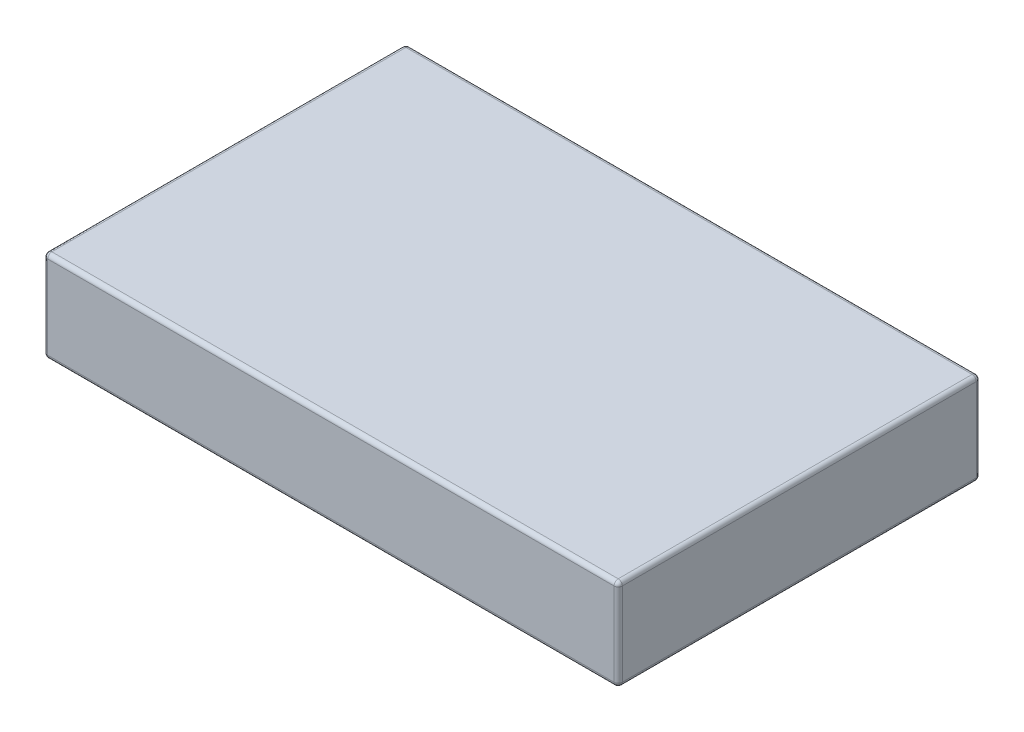
ISO-10303-21;
HEADER;
FILE_DESCRIPTION(('STEP AP214'),'2;1');
FILE_NAME('part.step','',(''),(''),'','','');
FILE_SCHEMA(('AUTOMOTIVE_DESIGN { 1 0 10303 214 1 1 1 1 }'));
ENDSEC;
DATA;
#1=APPLICATION_CONTEXT('core data for automotive mechanical design processes');
#2=APPLICATION_PROTOCOL_DEFINITION('international standard','automotive_design',2000,#1);
#3=PRODUCT_CONTEXT('',#1,'mechanical');
#4=PRODUCT('Part','Part','',(#3));
#5=PRODUCT_RELATED_PRODUCT_CATEGORY('part','',(#4));
#6=PRODUCT_DEFINITION_FORMATION('','',#4);
#7=PRODUCT_DEFINITION_CONTEXT('part definition',#1,'design');
#8=PRODUCT_DEFINITION('design','',#6,#7);
#9=PRODUCT_DEFINITION_SHAPE('','',#8);
#10=(LENGTH_UNIT() NAMED_UNIT(*) SI_UNIT(.MILLI.,.METRE.));
#11=(NAMED_UNIT(*) PLANE_ANGLE_UNIT() SI_UNIT($,.RADIAN.));
#12=(NAMED_UNIT(*) SI_UNIT($,.STERADIAN.) SOLID_ANGLE_UNIT());
#13=UNCERTAINTY_MEASURE_WITH_UNIT(LENGTH_MEASURE(1.E-05),#10,'distance_accuracy_value','');
#14=(GEOMETRIC_REPRESENTATION_CONTEXT(3) GLOBAL_UNCERTAINTY_ASSIGNED_CONTEXT((#13)) GLOBAL_UNIT_ASSIGNED_CONTEXT((#10,
#11,#12)) REPRESENTATION_CONTEXT('',''));
#15=CARTESIAN_POINT('',(0.,0.,0.));
#16=DIRECTION('',(0.,0.,1.));
#17=DIRECTION('',(1.,0.,0.));
#18=AXIS2_PLACEMENT_3D('',#15,#16,#17);
#19=CARTESIAN_POINT('',(-69.,22.,43.5));
#20=DIRECTION('',(0.,0.,-1.));
#21=DIRECTION('',(-1.,0.,0.));
#22=AXIS2_PLACEMENT_3D('',#19,#20,#21);
#23=PLANE('',#22);
#24=DIRECTION('',(0.,-1.,0.));
#25=VECTOR('',#24,1.);
#26=CARTESIAN_POINT('',(68.,22.,43.5));
#27=LINE('',#26,#25);
#28=CARTESIAN_POINT('',(68.,1.,43.5));
#29=VERTEX_POINT('',#28);
#30=CARTESIAN_POINT('',(68.,21.,43.5));
#31=VERTEX_POINT('',#30);
#32=EDGE_CURVE('E134',#29,#31,#27,.F.);
#33=ORIENTED_EDGE('',*,*,#32,.T.);
#34=DIRECTION('',(1.,0.,0.));
#35=VECTOR('',#34,1.);
#36=CARTESIAN_POINT('',(-69.,21.,43.5));
#37=LINE('',#36,#35);
#38=CARTESIAN_POINT('',(-68.,21.,43.5));
#39=VERTEX_POINT('',#38);
#40=EDGE_CURVE('E132',#31,#39,#37,.F.);
#41=ORIENTED_EDGE('',*,*,#40,.T.);
#42=DIRECTION('',(0.,-1.,0.));
#43=VECTOR('',#42,1.);
#44=CARTESIAN_POINT('',(-68.,22.,43.5));
#45=LINE('',#44,#43);
#46=CARTESIAN_POINT('',(-68.,1.,43.5));
#47=VERTEX_POINT('',#46);
#48=EDGE_CURVE('E120',#39,#47,#45,.T.);
#49=ORIENTED_EDGE('',*,*,#48,.T.);
#50=DIRECTION('',(1.,0.,0.));
#51=VECTOR('',#50,1.);
#52=CARTESIAN_POINT('',(-69.,1.,43.5));
#53=LINE('',#52,#51);
#54=EDGE_CURVE('E129',#47,#29,#53,.T.);
#55=ORIENTED_EDGE('',*,*,#54,.T.);
#56=EDGE_LOOP('',(#33,#41,#49,#55));
#57=FACE_BOUND('',#56,.T.);
#58=ADVANCED_FACE('F18',(#57),#23,.F.);
#59=CARTESIAN_POINT('',(69.,22.,43.5));
#60=DIRECTION('',(-1.,0.,0.));
#61=DIRECTION('',(0.,0.,1.));
#62=AXIS2_PLACEMENT_3D('',#59,#60,#61);
#63=PLANE('',#62);
#64=DIRECTION('',(0.,-1.,0.));
#65=VECTOR('',#64,1.);
#66=CARTESIAN_POINT('',(69.,22.,42.5));
#67=LINE('',#66,#65);
#68=CARTESIAN_POINT('',(69.,21.,42.5));
#69=VERTEX_POINT('',#68);
#70=CARTESIAN_POINT('',(69.,1.,42.5));
#71=VERTEX_POINT('',#70);
#72=EDGE_CURVE('E147',#69,#71,#67,.T.);
#73=ORIENTED_EDGE('',*,*,#72,.T.);
#74=DIRECTION('',(0.,0.,-1.));
#75=VECTOR('',#74,1.);
#76=CARTESIAN_POINT('',(69.,1.,43.5));
#77=LINE('',#76,#75);
#78=CARTESIAN_POINT('',(69.,1.,-42.5));
#79=VERTEX_POINT('',#78);
#80=EDGE_CURVE('E174',#71,#79,#77,.T.);
#81=ORIENTED_EDGE('',*,*,#80,.T.);
#82=DIRECTION('',(0.,-1.,0.));
#83=VECTOR('',#82,1.);
#84=CARTESIAN_POINT('',(69.,22.,-42.5));
#85=LINE('',#84,#83);
#86=CARTESIAN_POINT('',(69.,21.,-42.5));
#87=VERTEX_POINT('',#86);
#88=EDGE_CURVE('E171',#79,#87,#85,.F.);
#89=ORIENTED_EDGE('',*,*,#88,.T.);
#90=DIRECTION('',(0.,0.,-1.));
#91=VECTOR('',#90,1.);
#92=CARTESIAN_POINT('',(69.,21.,42.5));
#93=LINE('',#92,#91);
#94=EDGE_CURVE('E162',#87,#69,#93,.F.);
#95=ORIENTED_EDGE('',*,*,#94,.T.);
#96=EDGE_LOOP('',(#73,#81,#89,#95));
#97=FACE_BOUND('',#96,.T.);
#98=ADVANCED_FACE('F281',(#97),#63,.F.);
#99=CARTESIAN_POINT('',(69.,22.,-43.5));
#100=DIRECTION('',(0.,0.,1.));
#101=DIRECTION('',(1.,0.,0.));
#102=AXIS2_PLACEMENT_3D('',#99,#100,#101);
#103=PLANE('',#102);
#104=DIRECTION('',(-1.,0.,0.));
#105=VECTOR('',#104,1.);
#106=CARTESIAN_POINT('',(69.,1.,-43.5));
#107=LINE('',#106,#105);
#108=CARTESIAN_POINT('',(68.,1.,-43.5));
#109=VERTEX_POINT('',#108);
#110=CARTESIAN_POINT('',(-68.,1.,-43.5));
#111=VERTEX_POINT('',#110);
#112=EDGE_CURVE('E186',#109,#111,#107,.T.);
#113=ORIENTED_EDGE('',*,*,#112,.T.);
#114=DIRECTION('',(0.,-1.,0.));
#115=VECTOR('',#114,1.);
#116=CARTESIAN_POINT('',(-68.,22.,-43.5));
#117=LINE('',#116,#115);
#118=CARTESIAN_POINT('',(-68.,21.,-43.5));
#119=VERTEX_POINT('',#118);
#120=EDGE_CURVE('E189',#111,#119,#117,.F.);
#121=ORIENTED_EDGE('',*,*,#120,.T.);
#122=DIRECTION('',(-1.,0.,0.));
#123=VECTOR('',#122,1.);
#124=CARTESIAN_POINT('',(69.,21.,-43.5));
#125=LINE('',#124,#123);
#126=CARTESIAN_POINT('',(68.,21.,-43.5));
#127=VERTEX_POINT('',#126);
#128=EDGE_CURVE('E165',#119,#127,#125,.F.);
#129=ORIENTED_EDGE('',*,*,#128,.T.);
#130=DIRECTION('',(0.,-1.,0.));
#131=VECTOR('',#130,1.);
#132=CARTESIAN_POINT('',(68.,22.,-43.5));
#133=LINE('',#132,#131);
#134=EDGE_CURVE('E180',#127,#109,#133,.T.);
#135=ORIENTED_EDGE('',*,*,#134,.T.);
#136=EDGE_LOOP('',(#113,#121,#129,#135));
#137=FACE_BOUND('',#136,.T.);
#138=ADVANCED_FACE('F287',(#137),#103,.F.);
#139=CARTESIAN_POINT('',(-69.,22.,-43.5));
#140=DIRECTION('',(1.,0.,0.));
#141=DIRECTION('',(0.,0.,-1.));
#142=AXIS2_PLACEMENT_3D('',#139,#140,#141);
#143=PLANE('',#142);
#144=DIRECTION('',(0.,-1.,0.));
#145=VECTOR('',#144,1.);
#146=CARTESIAN_POINT('',(-69.,22.,-42.5));
#147=LINE('',#146,#145);
#148=CARTESIAN_POINT('',(-69.,21.,-42.5));
#149=VERTEX_POINT('',#148);
#150=CARTESIAN_POINT('',(-69.,1.,-42.5));
#151=VERTEX_POINT('',#150);
#152=EDGE_CURVE('E183',#149,#151,#147,.T.);
#153=ORIENTED_EDGE('',*,*,#152,.T.);
#154=DIRECTION('',(0.,0.,1.));
#155=VECTOR('',#154,1.);
#156=CARTESIAN_POINT('',(-69.,1.,-43.5));
#157=LINE('',#156,#155);
#158=CARTESIAN_POINT('',(-69.,1.,42.5));
#159=VERTEX_POINT('',#158);
#160=EDGE_CURVE('E227',#151,#159,#157,.T.);
#161=ORIENTED_EDGE('',*,*,#160,.T.);
#162=DIRECTION('',(0.,-1.,0.));
#163=VECTOR('',#162,1.);
#164=CARTESIAN_POINT('',(-69.,22.,42.5));
#165=LINE('',#164,#163);
#166=CARTESIAN_POINT('',(-69.,21.,42.5));
#167=VERTEX_POINT('',#166);
#168=EDGE_CURVE('E123',#159,#167,#165,.F.);
#169=ORIENTED_EDGE('',*,*,#168,.T.);
#170=DIRECTION('',(0.,0.,1.));
#171=VECTOR('',#170,1.);
#172=CARTESIAN_POINT('',(-69.,21.,-43.5));
#173=LINE('',#172,#171);
#174=EDGE_CURVE('E168',#167,#149,#173,.F.);
#175=ORIENTED_EDGE('',*,*,#174,.T.);
#176=EDGE_LOOP('',(#153,#161,#169,#175));
#177=FACE_BOUND('',#176,.T.);
#178=ADVANCED_FACE('F408',(#177),#143,.F.);
#179=CARTESIAN_POINT('',(0.,22.,0.));
#180=DIRECTION('',(0.,1.,0.));
#181=DIRECTION('',(0.,0.,1.));
#182=AXIS2_PLACEMENT_3D('',#179,#180,#181);
#183=PLANE('',#182);
#184=DIRECTION('',(1.,0.,0.));
#185=VECTOR('',#184,1.);
#186=CARTESIAN_POINT('',(69.,22.,42.5));
#187=LINE('',#186,#185);
#188=CARTESIAN_POINT('',(-68.,22.,42.5));
#189=VERTEX_POINT('',#188);
#190=CARTESIAN_POINT('',(68.,22.,42.5));
#191=VERTEX_POINT('',#190);
#192=EDGE_CURVE('E139',#189,#191,#187,.T.);
#193=ORIENTED_EDGE('',*,*,#192,.T.);
#194=DIRECTION('',(0.,0.,-1.));
#195=VECTOR('',#194,1.);
#196=CARTESIAN_POINT('',(68.,22.,-43.5));
#197=LINE('',#196,#195);
#198=CARTESIAN_POINT('',(68.,22.,-42.5));
#199=VERTEX_POINT('',#198);
#200=EDGE_CURVE('E159',#191,#199,#197,.T.);
#201=ORIENTED_EDGE('',*,*,#200,.T.);
#202=DIRECTION('',(-1.,0.,0.));
#203=VECTOR('',#202,1.);
#204=CARTESIAN_POINT('',(-69.,22.,-42.5));
#205=LINE('',#204,#203);
#206=CARTESIAN_POINT('',(-68.,22.,-42.5));
#207=VERTEX_POINT('',#206);
#208=EDGE_CURVE('E156',#199,#207,#205,.T.);
#209=ORIENTED_EDGE('',*,*,#208,.T.);
#210=DIRECTION('',(0.,0.,1.));
#211=VECTOR('',#210,1.);
#212=CARTESIAN_POINT('',(-68.,22.,42.5));
#213=LINE('',#212,#211);
#214=EDGE_CURVE('E153',#207,#189,#213,.T.);
#215=ORIENTED_EDGE('',*,*,#214,.T.);
#216=EDGE_LOOP('',(#193,#201,#209,#215));
#217=FACE_BOUND('',#216,.T.);
#218=ADVANCED_FACE('F389',(#217),#183,.T.);
#219=CARTESIAN_POINT('',(0.,0.,0.));
#220=DIRECTION('',(0.,1.,0.));
#221=DIRECTION('',(0.,0.,1.));
#222=AXIS2_PLACEMENT_3D('',#219,#220,#221);
#223=PLANE('',#222);
#224=CARTESIAN_POINT('',(-54.5,0.,37.5));
#225=DIRECTION('',(0.,1.,0.));
#226=DIRECTION('',(0.,0.,1.));
#227=AXIS2_PLACEMENT_3D('',#224,#225,#226);
#228=CIRCLE('',#227,1.2295);
#229=CARTESIAN_POINT('',(-54.5,0.,38.7295));
#230=VERTEX_POINT('',#229);
#231=EDGE_CURVE('E259',#230,#230,#228,.T.);
#232=ORIENTED_EDGE('',*,*,#231,.T.);
#233=EDGE_LOOP('',(#232));
#234=FACE_BOUND('',#233,.T.);
#235=CARTESIAN_POINT('',(-54.5,0.,-37.5));
#236=DIRECTION('',(0.,1.,0.));
#237=DIRECTION('',(0.,0.,1.));
#238=AXIS2_PLACEMENT_3D('',#235,#236,#237);
#239=CIRCLE('',#238,1.2295);
#240=CARTESIAN_POINT('',(-54.5,0.,-36.2705));
#241=VERTEX_POINT('',#240);
#242=EDGE_CURVE('E240',#241,#241,#239,.T.);
#243=ORIENTED_EDGE('',*,*,#242,.T.);
#244=EDGE_LOOP('',(#243));
#245=FACE_BOUND('',#244,.T.);
#246=CARTESIAN_POINT('',(54.5,0.,-37.5));
#247=DIRECTION('',(0.,1.,0.));
#248=DIRECTION('',(0.,0.,1.));
#249=AXIS2_PLACEMENT_3D('',#246,#247,#248);
#250=CIRCLE('',#249,1.2295);
#251=CARTESIAN_POINT('',(54.5,0.,-36.2705));
#252=VERTEX_POINT('',#251);
#253=EDGE_CURVE('E247',#252,#252,#250,.T.);
#254=ORIENTED_EDGE('',*,*,#253,.T.);
#255=EDGE_LOOP('',(#254));
#256=FACE_BOUND('',#255,.T.);
#257=CARTESIAN_POINT('',(54.5,0.,37.5));
#258=DIRECTION('',(0.,1.,0.));
#259=DIRECTION('',(0.,0.,1.));
#260=AXIS2_PLACEMENT_3D('',#257,#258,#259);
#261=CIRCLE('',#260,1.2295);
#262=CARTESIAN_POINT('',(54.5,0.,38.7295));
#263=VERTEX_POINT('',#262);
#264=EDGE_CURVE('E254',#263,#263,#261,.T.);
#265=ORIENTED_EDGE('',*,*,#264,.T.);
#266=EDGE_LOOP('',(#265));
#267=FACE_BOUND('',#266,.T.);
#268=DIRECTION('',(1.,0.,0.));
#269=VECTOR('',#268,1.);
#270=CARTESIAN_POINT('',(0.,0.,42.5));
#271=LINE('',#270,#269);
#272=CARTESIAN_POINT('',(68.,0.,42.5));
#273=VERTEX_POINT('',#272);
#274=CARTESIAN_POINT('',(-68.,0.,42.5));
#275=VERTEX_POINT('',#274);
#276=EDGE_CURVE('E151',#273,#275,#271,.F.);
#277=ORIENTED_EDGE('',*,*,#276,.T.);
#278=DIRECTION('',(0.,0.,1.));
#279=VECTOR('',#278,1.);
#280=CARTESIAN_POINT('',(-68.,0.,0.));
#281=LINE('',#280,#279);
#282=CARTESIAN_POINT('',(-68.,0.,-42.5));
#283=VERTEX_POINT('',#282);
#284=EDGE_CURVE('E35',#275,#283,#281,.F.);
#285=ORIENTED_EDGE('',*,*,#284,.T.);
#286=DIRECTION('',(-1.,0.,0.));
#287=VECTOR('',#286,1.);
#288=CARTESIAN_POINT('',(0.,0.,-42.5));
#289=LINE('',#288,#287);
#290=CARTESIAN_POINT('',(68.,0.,-42.5));
#291=VERTEX_POINT('',#290);
#292=EDGE_CURVE('E192',#283,#291,#289,.F.);
#293=ORIENTED_EDGE('',*,*,#292,.T.);
#294=DIRECTION('',(0.,0.,-1.));
#295=VECTOR('',#294,1.);
#296=CARTESIAN_POINT('',(68.,0.,0.));
#297=LINE('',#296,#295);
#298=EDGE_CURVE('E177',#291,#273,#297,.F.);
#299=ORIENTED_EDGE('',*,*,#298,.T.);
#300=EDGE_LOOP('',(#277,#285,#293,#299));
#301=FACE_BOUND('',#300,.T.);
#302=ADVANCED_FACE('F305',(#234,#245,#256,#267,#301),#223,.F.);
#303=CARTESIAN_POINT('',(-69.,1.,42.5));
#304=DIRECTION('',(1.,0.,0.));
#305=DIRECTION('',(0.,0.,-1.));
#306=AXIS2_PLACEMENT_3D('',#303,#304,#305);
#307=CYLINDRICAL_SURFACE('',#306,1.);
#308=ORIENTED_EDGE('',*,*,#54,.F.);
#309=CARTESIAN_POINT('',(-68.,1.,42.5));
#310=DIRECTION('',(1.,0.,0.));
#311=DIRECTION('',(0.,0.,-1.));
#312=AXIS2_PLACEMENT_3D('',#309,#310,#311);
#313=CIRCLE('',#312,1.);
#314=EDGE_CURVE('E43',#47,#275,#313,.T.);
#315=ORIENTED_EDGE('',*,*,#314,.T.);
#316=ORIENTED_EDGE('',*,*,#276,.F.);
#317=CARTESIAN_POINT('',(68.,1.,42.5));
#318=DIRECTION('',(1.,0.,0.));
#319=DIRECTION('',(0.,0.,-1.));
#320=AXIS2_PLACEMENT_3D('',#317,#318,#319);
#321=CIRCLE('',#320,1.);
#322=EDGE_CURVE('E138',#273,#29,#321,.F.);
#323=ORIENTED_EDGE('',*,*,#322,.T.);
#324=EDGE_LOOP('',(#308,#315,#316,#323));
#325=FACE_BOUND('',#324,.T.);
#326=ADVANCED_FACE('F136',(#325),#307,.T.);
#327=CARTESIAN_POINT('',(-68.,22.,42.5));
#328=DIRECTION('',(0.,-1.,0.));
#329=DIRECTION('',(0.,0.,-1.));
#330=AXIS2_PLACEMENT_3D('',#327,#328,#329);
#331=CYLINDRICAL_SURFACE('',#330,1.);
#332=CARTESIAN_POINT('',(-68.,21.,42.5));
#333=DIRECTION('',(0.,-1.,0.));
#334=DIRECTION('',(0.,0.,-1.));
#335=AXIS2_PLACEMENT_3D('',#332,#333,#334);
#336=CIRCLE('',#335,1.);
#337=EDGE_CURVE('E113',#39,#167,#336,.T.);
#338=ORIENTED_EDGE('',*,*,#337,.T.);
#339=ORIENTED_EDGE('',*,*,#168,.F.);
#340=CARTESIAN_POINT('',(-68.,1.,42.5));
#341=DIRECTION('',(0.,-1.,0.));
#342=DIRECTION('',(0.,0.,-1.));
#343=AXIS2_PLACEMENT_3D('',#340,#341,#342);
#344=CIRCLE('',#343,1.);
#345=EDGE_CURVE('E111',#159,#47,#344,.F.);
#346=ORIENTED_EDGE('',*,*,#345,.T.);
#347=ORIENTED_EDGE('',*,*,#48,.F.);
#348=EDGE_LOOP('',(#338,#339,#346,#347));
#349=FACE_BOUND('',#348,.T.);
#350=ADVANCED_FACE('F119',(#349),#331,.T.);
#351=CARTESIAN_POINT('',(68.,22.,42.5));
#352=DIRECTION('',(0.,-1.,0.));
#353=DIRECTION('',(0.,0.,-1.));
#354=AXIS2_PLACEMENT_3D('',#351,#352,#353);
#355=CYLINDRICAL_SURFACE('',#354,1.);
#356=ORIENTED_EDGE('',*,*,#72,.F.);
#357=CARTESIAN_POINT('',(68.,21.,42.5));
#358=DIRECTION('',(0.,-1.,0.));
#359=DIRECTION('',(0.,0.,-1.));
#360=AXIS2_PLACEMENT_3D('',#357,#358,#359);
#361=CIRCLE('',#360,1.);
#362=EDGE_CURVE('E218',#69,#31,#361,.T.);
#363=ORIENTED_EDGE('',*,*,#362,.T.);
#364=ORIENTED_EDGE('',*,*,#32,.F.);
#365=CARTESIAN_POINT('',(68.,1.,42.5));
#366=DIRECTION('',(0.,-1.,0.));
#367=DIRECTION('',(0.,0.,-1.));
#368=AXIS2_PLACEMENT_3D('',#365,#366,#367);
#369=CIRCLE('',#368,1.);
#370=EDGE_CURVE('E201',#29,#71,#369,.F.);
#371=ORIENTED_EDGE('',*,*,#370,.T.);
#372=EDGE_LOOP('',(#356,#363,#364,#371));
#373=FACE_BOUND('',#372,.T.);
#374=ADVANCED_FACE('F296',(#373),#355,.T.);
#375=CARTESIAN_POINT('',(0.,21.,42.5));
#376=DIRECTION('',(-1.,0.,0.));
#377=DIRECTION('',(0.,0.,1.));
#378=AXIS2_PLACEMENT_3D('',#375,#376,#377);
#379=CYLINDRICAL_SURFACE('',#378,1.);
#380=ORIENTED_EDGE('',*,*,#192,.F.);
#381=CARTESIAN_POINT('',(-68.,21.,42.5));
#382=DIRECTION('',(-1.,0.,0.));
#383=DIRECTION('',(0.,0.,1.));
#384=AXIS2_PLACEMENT_3D('',#381,#382,#383);
#385=CIRCLE('',#384,1.);
#386=EDGE_CURVE('E11',#189,#39,#385,.F.);
#387=ORIENTED_EDGE('',*,*,#386,.T.);
#388=ORIENTED_EDGE('',*,*,#40,.F.);
#389=CARTESIAN_POINT('',(68.,21.,42.5));
#390=DIRECTION('',(-1.,0.,0.));
#391=DIRECTION('',(0.,0.,1.));
#392=AXIS2_PLACEMENT_3D('',#389,#390,#391);
#393=CIRCLE('',#392,1.);
#394=EDGE_CURVE('E213',#31,#191,#393,.T.);
#395=ORIENTED_EDGE('',*,*,#394,.T.);
#396=EDGE_LOOP('',(#380,#387,#388,#395));
#397=FACE_BOUND('',#396,.T.);
#398=ADVANCED_FACE('F292',(#397),#379,.T.);
#399=CARTESIAN_POINT('',(-68.,21.,0.));
#400=DIRECTION('',(0.,0.,-1.));
#401=DIRECTION('',(-1.,0.,0.));
#402=AXIS2_PLACEMENT_3D('',#399,#400,#401);
#403=CYLINDRICAL_SURFACE('',#402,1.);
#404=ORIENTED_EDGE('',*,*,#174,.F.);
#405=CARTESIAN_POINT('',(-68.,21.,42.5));
#406=DIRECTION('',(0.,0.,-1.));
#407=DIRECTION('',(-1.,0.,0.));
#408=AXIS2_PLACEMENT_3D('',#405,#406,#407);
#409=CIRCLE('',#408,1.);
#410=EDGE_CURVE('E27',#167,#189,#409,.T.);
#411=ORIENTED_EDGE('',*,*,#410,.T.);
#412=ORIENTED_EDGE('',*,*,#214,.F.);
#413=CARTESIAN_POINT('',(-68.,21.,-42.5));
#414=DIRECTION('',(0.,0.,-1.));
#415=DIRECTION('',(-1.,0.,0.));
#416=AXIS2_PLACEMENT_3D('',#413,#414,#415);
#417=CIRCLE('',#416,1.);
#418=EDGE_CURVE('E220',#207,#149,#417,.F.);
#419=ORIENTED_EDGE('',*,*,#418,.T.);
#420=EDGE_LOOP('',(#404,#411,#412,#419));
#421=FACE_BOUND('',#420,.T.);
#422=ADVANCED_FACE('F295',(#421),#403,.T.);
#423=CARTESIAN_POINT('',(0.,21.,-42.5));
#424=DIRECTION('',(1.,0.,0.));
#425=DIRECTION('',(0.,0.,-1.));
#426=AXIS2_PLACEMENT_3D('',#423,#424,#425);
#427=CYLINDRICAL_SURFACE('',#426,1.);
#428=ORIENTED_EDGE('',*,*,#128,.F.);
#429=CARTESIAN_POINT('',(-68.,21.,-42.5));
#430=DIRECTION('',(1.,0.,0.));
#431=DIRECTION('',(0.,0.,-1.));
#432=AXIS2_PLACEMENT_3D('',#429,#430,#431);
#433=CIRCLE('',#432,1.);
#434=EDGE_CURVE('E225',#119,#207,#433,.T.);
#435=ORIENTED_EDGE('',*,*,#434,.T.);
#436=ORIENTED_EDGE('',*,*,#208,.F.);
#437=CARTESIAN_POINT('',(68.,21.,-42.5));
#438=DIRECTION('',(1.,0.,0.));
#439=DIRECTION('',(0.,0.,-1.));
#440=AXIS2_PLACEMENT_3D('',#437,#438,#439);
#441=CIRCLE('',#440,1.);
#442=EDGE_CURVE('E209',#199,#127,#441,.F.);
#443=ORIENTED_EDGE('',*,*,#442,.T.);
#444=EDGE_LOOP('',(#428,#435,#436,#443));
#445=FACE_BOUND('',#444,.T.);
#446=ADVANCED_FACE('F310',(#445),#427,.T.);
#447=CARTESIAN_POINT('',(68.,21.,0.));
#448=DIRECTION('',(0.,0.,1.));
#449=DIRECTION('',(1.,0.,0.));
#450=AXIS2_PLACEMENT_3D('',#447,#448,#449);
#451=CYLINDRICAL_SURFACE('',#450,1.);
#452=ORIENTED_EDGE('',*,*,#200,.F.);
#453=CARTESIAN_POINT('',(68.,21.,42.5));
#454=DIRECTION('',(0.,0.,1.));
#455=DIRECTION('',(1.,0.,0.));
#456=AXIS2_PLACEMENT_3D('',#453,#454,#455);
#457=CIRCLE('',#456,1.);
#458=EDGE_CURVE('E216',#191,#69,#457,.F.);
#459=ORIENTED_EDGE('',*,*,#458,.T.);
#460=ORIENTED_EDGE('',*,*,#94,.F.);
#461=CARTESIAN_POINT('',(68.,21.,-42.5));
#462=DIRECTION('',(0.,0.,1.));
#463=DIRECTION('',(1.,0.,0.));
#464=AXIS2_PLACEMENT_3D('',#461,#462,#463);
#465=CIRCLE('',#464,1.);
#466=EDGE_CURVE('E207',#87,#199,#465,.T.);
#467=ORIENTED_EDGE('',*,*,#466,.T.);
#468=EDGE_LOOP('',(#452,#459,#460,#467));
#469=FACE_BOUND('',#468,.T.);
#470=ADVANCED_FACE('F306',(#469),#451,.T.);
#471=CARTESIAN_POINT('',(68.,22.,-42.5));
#472=DIRECTION('',(0.,-1.,0.));
#473=DIRECTION('',(0.,0.,-1.));
#474=AXIS2_PLACEMENT_3D('',#471,#472,#473);
#475=CYLINDRICAL_SURFACE('',#474,1.);
#476=ORIENTED_EDGE('',*,*,#134,.F.);
#477=CARTESIAN_POINT('',(68.,21.,-42.5));
#478=DIRECTION('',(0.,-1.,0.));
#479=DIRECTION('',(0.,0.,-1.));
#480=AXIS2_PLACEMENT_3D('',#477,#478,#479);
#481=CIRCLE('',#480,1.);
#482=EDGE_CURVE('E211',#127,#87,#481,.T.);
#483=ORIENTED_EDGE('',*,*,#482,.T.);
#484=ORIENTED_EDGE('',*,*,#88,.F.);
#485=CARTESIAN_POINT('',(68.,1.,-42.5));
#486=DIRECTION('',(0.,-1.,0.));
#487=DIRECTION('',(0.,0.,-1.));
#488=AXIS2_PLACEMENT_3D('',#485,#486,#487);
#489=CIRCLE('',#488,1.);
#490=EDGE_CURVE('E196',#79,#109,#489,.F.);
#491=ORIENTED_EDGE('',*,*,#490,.T.);
#492=EDGE_LOOP('',(#476,#483,#484,#491));
#493=FACE_BOUND('',#492,.T.);
#494=ADVANCED_FACE('F309',(#493),#475,.T.);
#495=CARTESIAN_POINT('',(68.,1.,43.5));
#496=DIRECTION('',(0.,0.,-1.));
#497=DIRECTION('',(-1.,0.,0.));
#498=AXIS2_PLACEMENT_3D('',#495,#496,#497);
#499=CYLINDRICAL_SURFACE('',#498,1.);
#500=ORIENTED_EDGE('',*,*,#80,.F.);
#501=CARTESIAN_POINT('',(68.,1.,42.5));
#502=DIRECTION('',(0.,0.,-1.));
#503=DIRECTION('',(-1.,0.,0.));
#504=AXIS2_PLACEMENT_3D('',#501,#502,#503);
#505=CIRCLE('',#504,1.);
#506=EDGE_CURVE('E204',#71,#273,#505,.T.);
#507=ORIENTED_EDGE('',*,*,#506,.T.);
#508=ORIENTED_EDGE('',*,*,#298,.F.);
#509=CARTESIAN_POINT('',(68.,1.,-42.5));
#510=DIRECTION('',(0.,0.,-1.));
#511=DIRECTION('',(-1.,0.,0.));
#512=AXIS2_PLACEMENT_3D('',#509,#510,#511);
#513=CIRCLE('',#512,1.);
#514=EDGE_CURVE('E194',#291,#79,#513,.F.);
#515=ORIENTED_EDGE('',*,*,#514,.T.);
#516=EDGE_LOOP('',(#500,#507,#508,#515));
#517=FACE_BOUND('',#516,.T.);
#518=ADVANCED_FACE('F318',(#517),#499,.T.);
#519=CARTESIAN_POINT('',(69.,1.,-42.5));
#520=DIRECTION('',(-1.,0.,0.));
#521=DIRECTION('',(0.,0.,1.));
#522=AXIS2_PLACEMENT_3D('',#519,#520,#521);
#523=CYLINDRICAL_SURFACE('',#522,1.);
#524=ORIENTED_EDGE('',*,*,#292,.F.);
#525=CARTESIAN_POINT('',(-68.,1.,-42.5));
#526=DIRECTION('',(-1.,0.,0.));
#527=DIRECTION('',(0.,0.,1.));
#528=AXIS2_PLACEMENT_3D('',#525,#526,#527);
#529=CIRCLE('',#528,1.);
#530=EDGE_CURVE('E124',#283,#111,#529,.F.);
#531=ORIENTED_EDGE('',*,*,#530,.T.);
#532=ORIENTED_EDGE('',*,*,#112,.F.);
#533=CARTESIAN_POINT('',(68.,1.,-42.5));
#534=DIRECTION('',(-1.,0.,0.));
#535=DIRECTION('',(0.,0.,1.));
#536=AXIS2_PLACEMENT_3D('',#533,#534,#535);
#537=CIRCLE('',#536,1.);
#538=EDGE_CURVE('E198',#109,#291,#537,.T.);
#539=ORIENTED_EDGE('',*,*,#538,.T.);
#540=EDGE_LOOP('',(#524,#531,#532,#539));
#541=FACE_BOUND('',#540,.T.);
#542=ADVANCED_FACE('F321',(#541),#523,.T.);
#543=CARTESIAN_POINT('',(-68.,22.,-42.5));
#544=DIRECTION('',(0.,-1.,0.));
#545=DIRECTION('',(0.,0.,-1.));
#546=AXIS2_PLACEMENT_3D('',#543,#544,#545);
#547=CYLINDRICAL_SURFACE('',#546,1.);
#548=ORIENTED_EDGE('',*,*,#120,.F.);
#549=CARTESIAN_POINT('',(-68.,1.,-42.5));
#550=DIRECTION('',(0.,-1.,0.));
#551=DIRECTION('',(0.,0.,-1.));
#552=AXIS2_PLACEMENT_3D('',#549,#550,#551);
#553=CIRCLE('',#552,1.);
#554=EDGE_CURVE('E231',#111,#151,#553,.F.);
#555=ORIENTED_EDGE('',*,*,#554,.T.);
#556=ORIENTED_EDGE('',*,*,#152,.F.);
#557=CARTESIAN_POINT('',(-68.,21.,-42.5));
#558=DIRECTION('',(0.,-1.,0.));
#559=DIRECTION('',(0.,0.,-1.));
#560=AXIS2_PLACEMENT_3D('',#557,#558,#559);
#561=CIRCLE('',#560,1.);
#562=EDGE_CURVE('E223',#149,#119,#561,.T.);
#563=ORIENTED_EDGE('',*,*,#562,.T.);
#564=EDGE_LOOP('',(#548,#555,#556,#563));
#565=FACE_BOUND('',#564,.T.);
#566=ADVANCED_FACE('F326',(#565),#547,.T.);
#567=CARTESIAN_POINT('',(68.,1.,-42.5));
#568=DIRECTION('',(0.,0.,1.));
#569=DIRECTION('',(1.,0.,0.));
#570=AXIS2_PLACEMENT_3D('',#567,#568,#569);
#571=SPHERICAL_SURFACE('',#570,1.);
#572=ORIENTED_EDGE('',*,*,#514,.F.);
#573=ORIENTED_EDGE('',*,*,#538,.F.);
#574=ORIENTED_EDGE('',*,*,#490,.F.);
#575=EDGE_LOOP('',(#572,#573,#574));
#576=FACE_BOUND('',#575,.T.);
#577=ADVANCED_FACE('F329',(#576),#571,.T.);
#578=CARTESIAN_POINT('',(68.,1.,42.5));
#579=DIRECTION('',(0.,0.,1.));
#580=DIRECTION('',(1.,0.,0.));
#581=AXIS2_PLACEMENT_3D('',#578,#579,#580);
#582=SPHERICAL_SURFACE('',#581,1.);
#583=ORIENTED_EDGE('',*,*,#322,.F.);
#584=ORIENTED_EDGE('',*,*,#506,.F.);
#585=ORIENTED_EDGE('',*,*,#370,.F.);
#586=EDGE_LOOP('',(#583,#584,#585));
#587=FACE_BOUND('',#586,.T.);
#588=ADVANCED_FACE('F336',(#587),#582,.T.);
#589=CARTESIAN_POINT('',(68.,21.,-42.5));
#590=DIRECTION('',(0.,0.,1.));
#591=DIRECTION('',(1.,0.,0.));
#592=AXIS2_PLACEMENT_3D('',#589,#590,#591);
#593=SPHERICAL_SURFACE('',#592,1.);
#594=ORIENTED_EDGE('',*,*,#466,.F.);
#595=ORIENTED_EDGE('',*,*,#482,.F.);
#596=ORIENTED_EDGE('',*,*,#442,.F.);
#597=EDGE_LOOP('',(#594,#595,#596));
#598=FACE_BOUND('',#597,.T.);
#599=ADVANCED_FACE('F340',(#598),#593,.T.);
#600=CARTESIAN_POINT('',(68.,21.,42.5));
#601=DIRECTION('',(0.,0.,1.));
#602=DIRECTION('',(1.,0.,0.));
#603=AXIS2_PLACEMENT_3D('',#600,#601,#602);
#604=SPHERICAL_SURFACE('',#603,1.);
#605=ORIENTED_EDGE('',*,*,#362,.F.);
#606=ORIENTED_EDGE('',*,*,#458,.F.);
#607=ORIENTED_EDGE('',*,*,#394,.F.);
#608=EDGE_LOOP('',(#605,#606,#607));
#609=FACE_BOUND('',#608,.T.);
#610=ADVANCED_FACE('F344',(#609),#604,.T.);
#611=CARTESIAN_POINT('',(-68.,21.,-42.5));
#612=DIRECTION('',(0.,0.,1.));
#613=DIRECTION('',(1.,0.,0.));
#614=AXIS2_PLACEMENT_3D('',#611,#612,#613);
#615=SPHERICAL_SURFACE('',#614,1.);
#616=ORIENTED_EDGE('',*,*,#434,.F.);
#617=ORIENTED_EDGE('',*,*,#562,.F.);
#618=ORIENTED_EDGE('',*,*,#418,.F.);
#619=EDGE_LOOP('',(#616,#617,#618));
#620=FACE_BOUND('',#619,.T.);
#621=ADVANCED_FACE('F348',(#620),#615,.T.);
#622=CARTESIAN_POINT('',(-68.,1.,-42.5));
#623=DIRECTION('',(0.,0.,1.));
#624=DIRECTION('',(1.,0.,0.));
#625=AXIS2_PLACEMENT_3D('',#622,#623,#624);
#626=SPHERICAL_SURFACE('',#625,1.);
#627=ORIENTED_EDGE('',*,*,#554,.F.);
#628=ORIENTED_EDGE('',*,*,#530,.F.);
#629=CARTESIAN_POINT('',(-68.,1.,-42.5));
#630=DIRECTION('',(0.,0.,1.));
#631=DIRECTION('',(1.,0.,0.));
#632=AXIS2_PLACEMENT_3D('',#629,#630,#631);
#633=CIRCLE('',#632,1.);
#634=EDGE_CURVE('E142',#151,#283,#633,.T.);
#635=ORIENTED_EDGE('',*,*,#634,.F.);
#636=EDGE_LOOP('',(#627,#628,#635));
#637=FACE_BOUND('',#636,.T.);
#638=ADVANCED_FACE('F352',(#637),#626,.T.);
#639=CARTESIAN_POINT('',(-68.,1.,-43.5));
#640=DIRECTION('',(0.,0.,1.));
#641=DIRECTION('',(1.,0.,0.));
#642=AXIS2_PLACEMENT_3D('',#639,#640,#641);
#643=CYLINDRICAL_SURFACE('',#642,1.);
#644=CARTESIAN_POINT('',(-68.,1.,42.5));
#645=DIRECTION('',(0.,0.,1.));
#646=DIRECTION('',(1.,0.,0.));
#647=AXIS2_PLACEMENT_3D('',#644,#645,#646);
#648=CIRCLE('',#647,1.);
#649=EDGE_CURVE('E112',#275,#159,#648,.F.);
#650=ORIENTED_EDGE('',*,*,#649,.T.);
#651=ORIENTED_EDGE('',*,*,#160,.F.);
#652=ORIENTED_EDGE('',*,*,#634,.T.);
#653=ORIENTED_EDGE('',*,*,#284,.F.);
#654=EDGE_LOOP('',(#650,#651,#652,#653));
#655=FACE_BOUND('',#654,.T.);
#656=ADVANCED_FACE('F354',(#655),#643,.T.);
#657=CARTESIAN_POINT('',(-68.,1.,42.5));
#658=DIRECTION('',(0.,0.,1.));
#659=DIRECTION('',(1.,0.,0.));
#660=AXIS2_PLACEMENT_3D('',#657,#658,#659);
#661=SPHERICAL_SURFACE('',#660,1.);
#662=ORIENTED_EDGE('',*,*,#649,.F.);
#663=ORIENTED_EDGE('',*,*,#314,.F.);
#664=ORIENTED_EDGE('',*,*,#345,.F.);
#665=EDGE_LOOP('',(#662,#663,#664));
#666=FACE_BOUND('',#665,.T.);
#667=ADVANCED_FACE('F110',(#666),#661,.T.);
#668=CARTESIAN_POINT('',(-68.,21.,42.5));
#669=DIRECTION('',(0.,0.,1.));
#670=DIRECTION('',(1.,0.,0.));
#671=AXIS2_PLACEMENT_3D('',#668,#669,#670);
#672=SPHERICAL_SURFACE('',#671,1.);
#673=ORIENTED_EDGE('',*,*,#337,.F.);
#674=ORIENTED_EDGE('',*,*,#386,.F.);
#675=ORIENTED_EDGE('',*,*,#410,.F.);
#676=EDGE_LOOP('',(#673,#674,#675));
#677=FACE_BOUND('',#676,.T.);
#678=ADVANCED_FACE('F363',(#677),#672,.T.);
#679=CARTESIAN_POINT('',(54.5,10.,37.5));
#680=DIRECTION('',(0.,-1.,0.));
#681=DIRECTION('',(0.,0.,-1.));
#682=AXIS2_PLACEMENT_3D('',#679,#680,#681);
#683=CYLINDRICAL_SURFACE('',#682,1.2295);
#684=ORIENTED_EDGE('',*,*,#264,.F.);
#685=EDGE_LOOP('',(#684));
#686=FACE_BOUND('',#685,.T.);
#687=CARTESIAN_POINT('',(54.5,10.,37.5));
#688=DIRECTION('',(0.,1.,0.));
#689=DIRECTION('',(0.,0.,1.));
#690=AXIS2_PLACEMENT_3D('',#687,#688,#689);
#691=CIRCLE('',#690,1.2295);
#692=CARTESIAN_POINT('',(54.5,10.,38.7295));
#693=VERTEX_POINT('',#692);
#694=EDGE_CURVE('E235',#693,#693,#691,.T.);
#695=ORIENTED_EDGE('',*,*,#694,.T.);
#696=EDGE_LOOP('',(#695));
#697=FACE_BOUND('',#696,.T.);
#698=ADVANCED_FACE('F366',(#686,#697),#683,.F.);
#699=CARTESIAN_POINT('',(54.5,10.,37.5));
#700=DIRECTION('',(0.,1.,0.));
#701=DIRECTION('',(0.,0.,1.));
#702=AXIS2_PLACEMENT_3D('',#699,#700,#701);
#703=PLANE('',#702);
#704=ORIENTED_EDGE('',*,*,#694,.F.);
#705=EDGE_LOOP('',(#704));
#706=FACE_BOUND('',#705,.T.);
#707=ADVANCED_FACE('F375',(#706),#703,.F.);
#708=CARTESIAN_POINT('',(54.5,10.,-37.5));
#709=DIRECTION('',(0.,-1.,0.));
#710=DIRECTION('',(0.,0.,-1.));
#711=AXIS2_PLACEMENT_3D('',#708,#709,#710);
#712=CYLINDRICAL_SURFACE('',#711,1.2295);
#713=ORIENTED_EDGE('',*,*,#253,.F.);
#714=EDGE_LOOP('',(#713));
#715=FACE_BOUND('',#714,.T.);
#716=CARTESIAN_POINT('',(54.5,10.,-37.5));
#717=DIRECTION('',(0.,1.,0.));
#718=DIRECTION('',(0.,0.,1.));
#719=AXIS2_PLACEMENT_3D('',#716,#717,#718);
#720=CIRCLE('',#719,1.2295);
#721=CARTESIAN_POINT('',(54.5,10.,-36.2705));
#722=VERTEX_POINT('',#721);
#723=EDGE_CURVE('E251',#722,#722,#720,.T.);
#724=ORIENTED_EDGE('',*,*,#723,.T.);
#725=EDGE_LOOP('',(#724));
#726=FACE_BOUND('',#725,.T.);
#727=ADVANCED_FACE('F373',(#715,#726),#712,.F.);
#728=CARTESIAN_POINT('',(54.5,10.,-37.5));
#729=DIRECTION('',(0.,1.,0.));
#730=DIRECTION('',(0.,0.,1.));
#731=AXIS2_PLACEMENT_3D('',#728,#729,#730);
#732=PLANE('',#731);
#733=ORIENTED_EDGE('',*,*,#723,.F.);
#734=EDGE_LOOP('',(#733));
#735=FACE_BOUND('',#734,.T.);
#736=ADVANCED_FACE('F371',(#735),#732,.F.);
#737=CARTESIAN_POINT('',(-54.5,10.,-37.5));
#738=DIRECTION('',(0.,-1.,0.));
#739=DIRECTION('',(0.,0.,-1.));
#740=AXIS2_PLACEMENT_3D('',#737,#738,#739);
#741=CYLINDRICAL_SURFACE('',#740,1.2295);
#742=ORIENTED_EDGE('',*,*,#242,.F.);
#743=EDGE_LOOP('',(#742));
#744=FACE_BOUND('',#743,.T.);
#745=CARTESIAN_POINT('',(-54.5,10.,-37.5));
#746=DIRECTION('',(0.,1.,0.));
#747=DIRECTION('',(0.,0.,1.));
#748=AXIS2_PLACEMENT_3D('',#745,#746,#747);
#749=CIRCLE('',#748,1.2295);
#750=CARTESIAN_POINT('',(-54.5,10.,-36.2705));
#751=VERTEX_POINT('',#750);
#752=EDGE_CURVE('E244',#751,#751,#749,.T.);
#753=ORIENTED_EDGE('',*,*,#752,.T.);
#754=EDGE_LOOP('',(#753));
#755=FACE_BOUND('',#754,.T.);
#756=ADVANCED_FACE('F368',(#744,#755),#741,.F.);
#757=CARTESIAN_POINT('',(-54.5,10.,-37.5));
#758=DIRECTION('',(0.,1.,0.));
#759=DIRECTION('',(0.,0.,1.));
#760=AXIS2_PLACEMENT_3D('',#757,#758,#759);
#761=PLANE('',#760);
#762=ORIENTED_EDGE('',*,*,#752,.F.);
#763=EDGE_LOOP('',(#762));
#764=FACE_BOUND('',#763,.T.);
#765=ADVANCED_FACE('F277',(#764),#761,.F.);
#766=CARTESIAN_POINT('',(-54.5,10.,37.5));
#767=DIRECTION('',(0.,-1.,0.));
#768=DIRECTION('',(0.,0.,-1.));
#769=AXIS2_PLACEMENT_3D('',#766,#767,#768);
#770=CYLINDRICAL_SURFACE('',#769,1.2295);
#771=ORIENTED_EDGE('',*,*,#231,.F.);
#772=EDGE_LOOP('',(#771));
#773=FACE_BOUND('',#772,.T.);
#774=CARTESIAN_POINT('',(-54.5,10.,37.5));
#775=DIRECTION('',(0.,1.,0.));
#776=DIRECTION('',(0.,0.,1.));
#777=AXIS2_PLACEMENT_3D('',#774,#775,#776);
#778=CIRCLE('',#777,1.2295);
#779=CARTESIAN_POINT('',(-54.5,10.,38.7295));
#780=VERTEX_POINT('',#779);
#781=EDGE_CURVE('E22',#780,#780,#778,.T.);
#782=ORIENTED_EDGE('',*,*,#781,.T.);
#783=EDGE_LOOP('',(#782));
#784=FACE_BOUND('',#783,.T.);
#785=ADVANCED_FACE('F20',(#773,#784),#770,.F.);
#786=CARTESIAN_POINT('',(-54.5,10.,37.5));
#787=DIRECTION('',(0.,1.,0.));
#788=DIRECTION('',(0.,0.,1.));
#789=AXIS2_PLACEMENT_3D('',#786,#787,#788);
#790=PLANE('',#789);
#791=ORIENTED_EDGE('',*,*,#781,.F.);
#792=EDGE_LOOP('',(#791));
#793=FACE_BOUND('',#792,.T.);
#794=ADVANCED_FACE('F270',(#793),#790,.F.);
#795=CLOSED_SHELL('',(#58,#98,#138,#178,#218,#302,#326,#350,#374,#398,#422,#446,#470,#494,#518,
#542,#566,#577,#588,#599,#610,#621,#638,#656,#667,#678,#698,#707,#727,#736,#756,#765,#785,#794));
#796=MANIFOLD_SOLID_BREP('B1',#795);
#797=ADVANCED_BREP_SHAPE_REPRESENTATION('',(#18,#796),#14);
#798=SHAPE_DEFINITION_REPRESENTATION(#9,#797);
ENDSEC;
END-ISO-10303-21;
